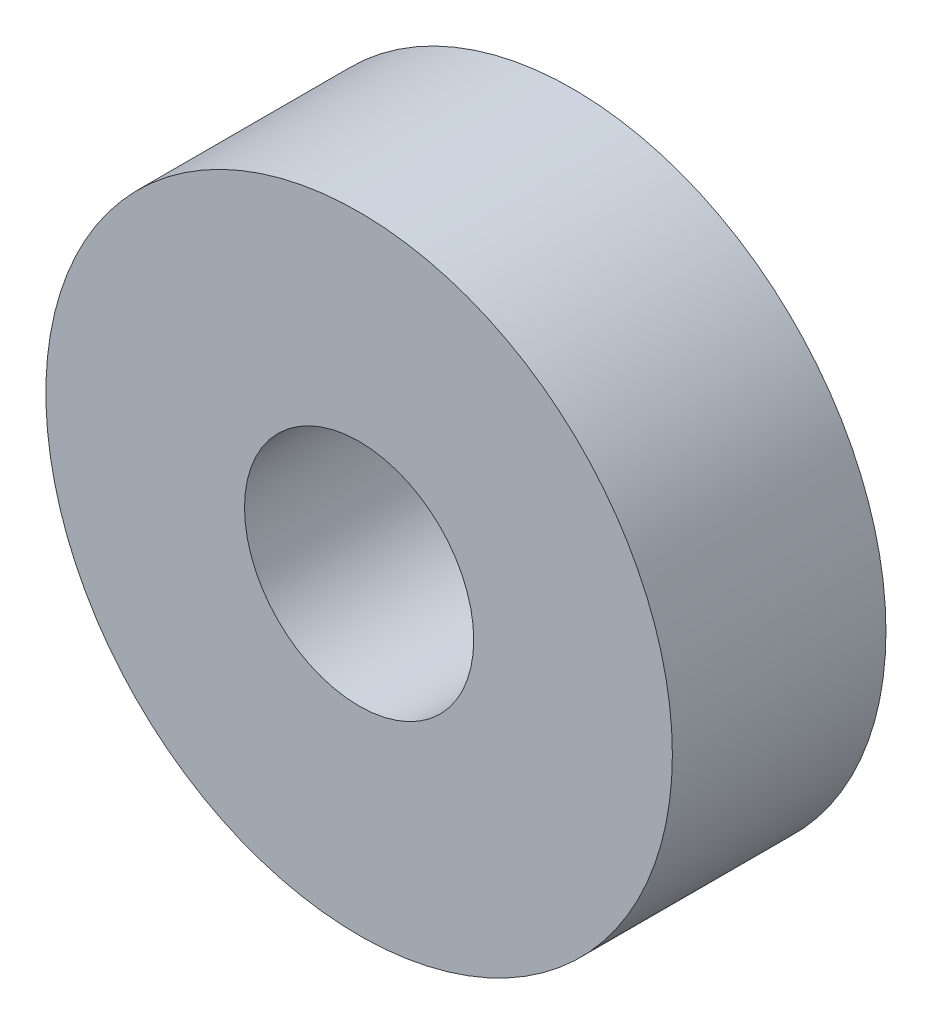
ISO-10303-21;
HEADER;
FILE_DESCRIPTION(('STEP AP214'),'2;1');
FILE_NAME('part.step','',(''),(''),'','','');
FILE_SCHEMA(('AUTOMOTIVE_DESIGN { 1 0 10303 214 1 1 1 1 }'));
ENDSEC;
DATA;
#1=APPLICATION_CONTEXT('core data for automotive mechanical design processes');
#2=APPLICATION_PROTOCOL_DEFINITION('international standard','automotive_design',2000,#1);
#3=PRODUCT_CONTEXT('',#1,'mechanical');
#4=PRODUCT('Part','Part','',(#3));
#5=PRODUCT_RELATED_PRODUCT_CATEGORY('part','',(#4));
#6=PRODUCT_DEFINITION_FORMATION('','',#4);
#7=PRODUCT_DEFINITION_CONTEXT('part definition',#1,'design');
#8=PRODUCT_DEFINITION('design','',#6,#7);
#9=PRODUCT_DEFINITION_SHAPE('','',#8);
#10=(LENGTH_UNIT() NAMED_UNIT(*) SI_UNIT(.MILLI.,.METRE.));
#11=(NAMED_UNIT(*) PLANE_ANGLE_UNIT() SI_UNIT($,.RADIAN.));
#12=(NAMED_UNIT(*) SI_UNIT($,.STERADIAN.) SOLID_ANGLE_UNIT());
#13=UNCERTAINTY_MEASURE_WITH_UNIT(LENGTH_MEASURE(1.E-05),#10,'distance_accuracy_value','');
#14=(GEOMETRIC_REPRESENTATION_CONTEXT(3) GLOBAL_UNCERTAINTY_ASSIGNED_CONTEXT((#13)) GLOBAL_UNIT_ASSIGNED_CONTEXT((#10,
#11,#12)) REPRESENTATION_CONTEXT('',''));
#15=CARTESIAN_POINT('',(0.,0.,0.));
#16=DIRECTION('',(0.,0.,1.));
#17=DIRECTION('',(1.,0.,0.));
#18=AXIS2_PLACEMENT_3D('',#15,#16,#17);
#19=CARTESIAN_POINT('',(0.,0.,15.));
#20=DIRECTION('',(0.,0.,-1.));
#21=DIRECTION('',(-1.,0.,0.));
#22=AXIS2_PLACEMENT_3D('',#19,#20,#21);
#23=CYLINDRICAL_SURFACE('',#22,22.);
#24=CARTESIAN_POINT('',(0.,0.,15.));
#25=DIRECTION('',(0.,0.,1.));
#26=DIRECTION('',(1.,0.,0.));
#27=AXIS2_PLACEMENT_3D('',#24,#25,#26);
#28=CIRCLE('',#27,22.);
#29=CARTESIAN_POINT('',(22.,0.,15.));
#30=VERTEX_POINT('',#29);
#31=EDGE_CURVE('E10',#30,#30,#28,.T.);
#32=ORIENTED_EDGE('',*,*,#31,.F.);
#33=EDGE_LOOP('',(#32));
#34=FACE_BOUND('',#33,.T.);
#35=CARTESIAN_POINT('',(0.,0.,0.));
#36=DIRECTION('',(0.,0.,1.));
#37=DIRECTION('',(1.,0.,0.));
#38=AXIS2_PLACEMENT_3D('',#35,#36,#37);
#39=CIRCLE('',#38,22.);
#40=CARTESIAN_POINT('',(22.,0.,0.));
#41=VERTEX_POINT('',#40);
#42=EDGE_CURVE('E34',#41,#41,#39,.T.);
#43=ORIENTED_EDGE('',*,*,#42,.T.);
#44=EDGE_LOOP('',(#43));
#45=FACE_BOUND('',#44,.T.);
#46=ADVANCED_FACE('F31',(#34,#45),#23,.T.);
#47=CARTESIAN_POINT('',(0.,0.,15.));
#48=DIRECTION('',(0.,0.,1.));
#49=DIRECTION('',(1.,0.,0.));
#50=AXIS2_PLACEMENT_3D('',#47,#48,#49);
#51=PLANE('',#50);
#52=CARTESIAN_POINT('',(0.,0.,15.));
#53=DIRECTION('',(0.,0.,1.));
#54=DIRECTION('',(1.,0.,0.));
#55=AXIS2_PLACEMENT_3D('',#52,#53,#54);
#56=CIRCLE('',#55,8.05);
#57=CARTESIAN_POINT('',(8.05,0.,15.));
#58=VERTEX_POINT('',#57);
#59=EDGE_CURVE('E55',#58,#58,#56,.T.);
#60=ORIENTED_EDGE('',*,*,#59,.F.);
#61=EDGE_LOOP('',(#60));
#62=FACE_BOUND('',#61,.T.);
#63=ORIENTED_EDGE('',*,*,#31,.T.);
#64=EDGE_LOOP('',(#63));
#65=FACE_BOUND('',#64,.T.);
#66=ADVANCED_FACE('F70',(#62,#65),#51,.T.);
#67=CARTESIAN_POINT('',(0.,0.,0.));
#68=DIRECTION('',(0.,0.,1.));
#69=DIRECTION('',(1.,0.,0.));
#70=AXIS2_PLACEMENT_3D('',#67,#68,#69);
#71=PLANE('',#70);
#72=CARTESIAN_POINT('',(0.,0.,0.));
#73=DIRECTION('',(0.,0.,-1.));
#74=DIRECTION('',(-1.,0.,0.));
#75=AXIS2_PLACEMENT_3D('',#72,#73,#74);
#76=CIRCLE('',#75,17.85);
#77=CARTESIAN_POINT('',(-17.85,0.,0.));
#78=VERTEX_POINT('',#77);
#79=EDGE_CURVE('E43',#78,#78,#76,.T.);
#80=ORIENTED_EDGE('',*,*,#79,.F.);
#81=EDGE_LOOP('',(#80));
#82=FACE_BOUND('',#81,.T.);
#83=ORIENTED_EDGE('',*,*,#42,.F.);
#84=EDGE_LOOP('',(#83));
#85=FACE_BOUND('',#84,.T.);
#86=ADVANCED_FACE('F72',(#82,#85),#71,.F.);
#87=CARTESIAN_POINT('',(0.,0.,10.));
#88=DIRECTION('',(0.,0.,-1.));
#89=DIRECTION('',(-1.,0.,0.));
#90=AXIS2_PLACEMENT_3D('',#87,#88,#89);
#91=CYLINDRICAL_SURFACE('',#90,17.85);
#92=CARTESIAN_POINT('',(0.,0.,10.));
#93=DIRECTION('',(0.,0.,-1.));
#94=DIRECTION('',(-1.,0.,0.));
#95=AXIS2_PLACEMENT_3D('',#92,#93,#94);
#96=CIRCLE('',#95,17.85);
#97=CARTESIAN_POINT('',(-17.85,0.,10.));
#98=VERTEX_POINT('',#97);
#99=EDGE_CURVE('E41',#98,#98,#96,.T.);
#100=ORIENTED_EDGE('',*,*,#99,.F.);
#101=EDGE_LOOP('',(#100));
#102=FACE_BOUND('',#101,.T.);
#103=ORIENTED_EDGE('',*,*,#79,.T.);
#104=EDGE_LOOP('',(#103));
#105=FACE_BOUND('',#104,.T.);
#106=ADVANCED_FACE('F78',(#102,#105),#91,.F.);
#107=CARTESIAN_POINT('',(0.,0.,10.));
#108=DIRECTION('',(0.,0.,-1.));
#109=DIRECTION('',(-1.,0.,0.));
#110=AXIS2_PLACEMENT_3D('',#107,#108,#109);
#111=PLANE('',#110);
#112=CARTESIAN_POINT('',(0.,0.,10.));
#113=DIRECTION('',(0.,0.,-1.));
#114=DIRECTION('',(-1.,0.,0.));
#115=AXIS2_PLACEMENT_3D('',#112,#113,#114);
#116=CIRCLE('',#115,12.5);
#117=CARTESIAN_POINT('',(-12.5,0.,10.));
#118=VERTEX_POINT('',#117);
#119=EDGE_CURVE('E46',#118,#118,#116,.T.);
#120=ORIENTED_EDGE('',*,*,#119,.F.);
#121=EDGE_LOOP('',(#120));
#122=FACE_BOUND('',#121,.T.);
#123=ORIENTED_EDGE('',*,*,#99,.T.);
#124=EDGE_LOOP('',(#123));
#125=FACE_BOUND('',#124,.T.);
#126=ADVANCED_FACE('F84',(#122,#125),#111,.T.);
#127=CARTESIAN_POINT('',(0.,0.,10.));
#128=DIRECTION('',(0.,0.,-1.));
#129=DIRECTION('',(-1.,0.,0.));
#130=AXIS2_PLACEMENT_3D('',#127,#128,#129);
#131=CYLINDRICAL_SURFACE('',#130,12.5);
#132=ORIENTED_EDGE('',*,*,#119,.T.);
#133=EDGE_LOOP('',(#132));
#134=FACE_BOUND('',#133,.T.);
#135=CARTESIAN_POINT('',(0.,0.,0.));
#136=DIRECTION('',(0.,0.,-1.));
#137=DIRECTION('',(-1.,0.,0.));
#138=AXIS2_PLACEMENT_3D('',#135,#136,#137);
#139=CIRCLE('',#138,12.5);
#140=CARTESIAN_POINT('',(-12.5,0.,0.));
#141=VERTEX_POINT('',#140);
#142=EDGE_CURVE('E49',#141,#141,#139,.T.);
#143=ORIENTED_EDGE('',*,*,#142,.F.);
#144=EDGE_LOOP('',(#143));
#145=FACE_BOUND('',#144,.T.);
#146=ADVANCED_FACE('F88',(#134,#145),#131,.T.);
#147=CARTESIAN_POINT('',(0.,0.,0.));
#148=DIRECTION('',(0.,0.,1.));
#149=DIRECTION('',(1.,0.,0.));
#150=AXIS2_PLACEMENT_3D('',#147,#148,#149);
#151=CIRCLE('',#150,8.05);
#152=CARTESIAN_POINT('',(8.05,0.,0.));
#153=VERTEX_POINT('',#152);
#154=EDGE_CURVE('E52',#153,#153,#151,.T.);
#155=ORIENTED_EDGE('',*,*,#154,.T.);
#156=EDGE_LOOP('',(#155));
#157=FACE_BOUND('',#156,.T.);
#158=ORIENTED_EDGE('',*,*,#142,.T.);
#159=EDGE_LOOP('',(#158));
#160=FACE_BOUND('',#159,.T.);
#161=ADVANCED_FACE('F61',(#157,#160),#71,.F.);
#162=CARTESIAN_POINT('',(0.,0.,0.));
#163=DIRECTION('',(0.,0.,1.));
#164=DIRECTION('',(1.,0.,0.));
#165=AXIS2_PLACEMENT_3D('',#162,#163,#164);
#166=CYLINDRICAL_SURFACE('',#165,8.05);
#167=ORIENTED_EDGE('',*,*,#154,.F.);
#168=EDGE_LOOP('',(#167));
#169=FACE_BOUND('',#168,.T.);
#170=ORIENTED_EDGE('',*,*,#59,.T.);
#171=EDGE_LOOP('',(#170));
#172=FACE_BOUND('',#171,.T.);
#173=ADVANCED_FACE('F64',(#169,#172),#166,.F.);
#174=CLOSED_SHELL('',(#46,#66,#86,#106,#126,#146,#161,#173));
#175=MANIFOLD_SOLID_BREP('B2',#174);
#176=ADVANCED_BREP_SHAPE_REPRESENTATION('',(#18,#175),#14);
#177=SHAPE_DEFINITION_REPRESENTATION(#9,#176);
ENDSEC;
END-ISO-10303-21;
